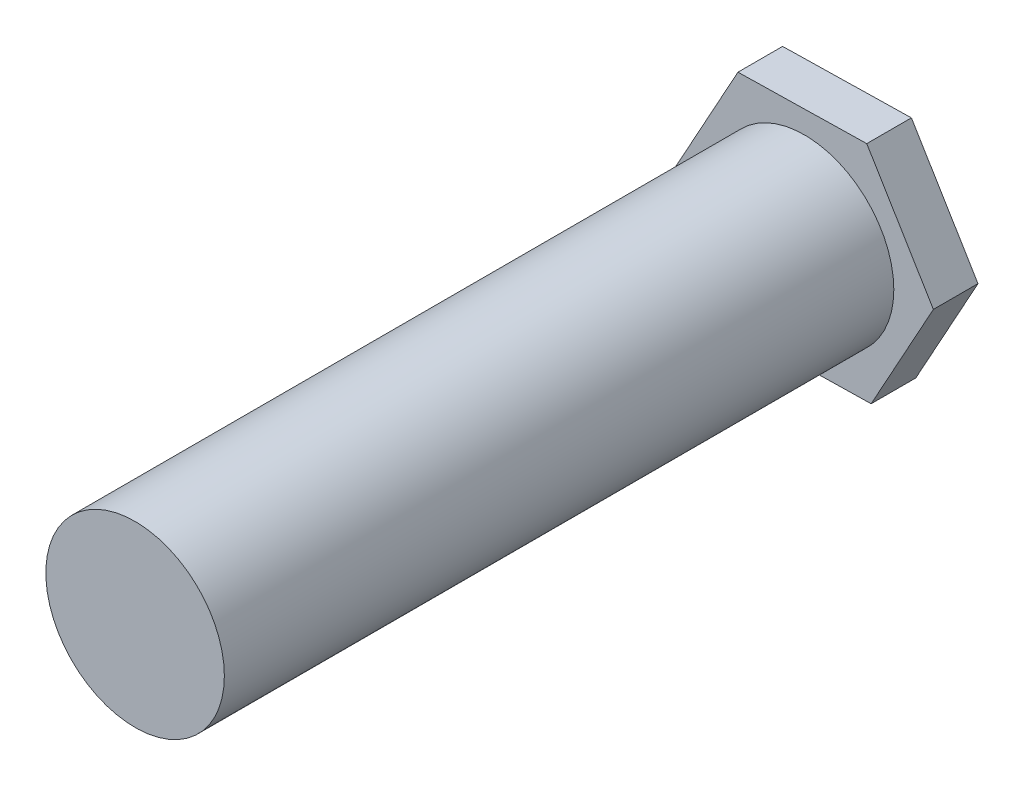
ISO-10303-21;
HEADER;
FILE_DESCRIPTION(('STEP AP214'),'2;1');
FILE_NAME('part.step','',(''),(''),'','','');
FILE_SCHEMA(('AUTOMOTIVE_DESIGN { 1 0 10303 214 1 1 1 1 }'));
ENDSEC;
DATA;
#1=APPLICATION_CONTEXT('core data for automotive mechanical design processes');
#2=APPLICATION_PROTOCOL_DEFINITION('international standard','automotive_design',2000,#1);
#3=PRODUCT_CONTEXT('',#1,'mechanical');
#4=PRODUCT('Part','Part','',(#3));
#5=PRODUCT_RELATED_PRODUCT_CATEGORY('part','',(#4));
#6=PRODUCT_DEFINITION_FORMATION('','',#4);
#7=PRODUCT_DEFINITION_CONTEXT('part definition',#1,'design');
#8=PRODUCT_DEFINITION('design','',#6,#7);
#9=PRODUCT_DEFINITION_SHAPE('','',#8);
#10=(LENGTH_UNIT() NAMED_UNIT(*) SI_UNIT(.MILLI.,.METRE.));
#11=(NAMED_UNIT(*) PLANE_ANGLE_UNIT() SI_UNIT($,.RADIAN.));
#12=(NAMED_UNIT(*) SI_UNIT($,.STERADIAN.) SOLID_ANGLE_UNIT());
#13=UNCERTAINTY_MEASURE_WITH_UNIT(LENGTH_MEASURE(1.E-05),#10,'distance_accuracy_value','');
#14=(GEOMETRIC_REPRESENTATION_CONTEXT(3) GLOBAL_UNCERTAINTY_ASSIGNED_CONTEXT((#13)) GLOBAL_UNIT_ASSIGNED_CONTEXT((#10,
#11,#12)) REPRESENTATION_CONTEXT('',''));
#15=CARTESIAN_POINT('',(0.,0.,0.));
#16=DIRECTION('',(0.,0.,1.));
#17=DIRECTION('',(1.,0.,0.));
#18=AXIS2_PLACEMENT_3D('',#15,#16,#17);
#19=CARTESIAN_POINT('',(36.6546728834895,0.719923008183474,12.7));
#20=DIRECTION('',(-0.856039963958716,-0.51690964404387,0.));
#21=DIRECTION('',(0.51690964404387,-0.856039963958716,0.));
#22=AXIS2_PLACEMENT_3D('',#19,#20,#21);
#23=PLANE('',#22);
#24=DIRECTION('',(-0.51690964404387,0.856039963958716,0.));
#25=VECTOR('',#24,1.);
#26=CARTESIAN_POINT('',(36.6546728834895,0.719923008183474,0.));
#27=LINE('',#26,#25);
#28=CARTESIAN_POINT('',(36.6546728834895,0.719923008183474,0.));
#29=VERTEX_POINT('',#28);
#30=CARTESIAN_POINT('',(17.703864827889,32.1038393886022,0.));
#31=VERTEX_POINT('',#30);
#32=EDGE_CURVE('E141',#29,#31,#27,.T.);
#33=ORIENTED_EDGE('',*,*,#32,.T.);
#34=DIRECTION('',(0.,0.,-1.));
#35=VECTOR('',#34,1.);
#36=CARTESIAN_POINT('',(17.703864827889,32.1038393886022,12.7));
#37=LINE('',#36,#35);
#38=CARTESIAN_POINT('',(17.703864827889,32.1038393886022,12.7));
#39=VERTEX_POINT('',#38);
#40=EDGE_CURVE('E58',#39,#31,#37,.T.);
#41=ORIENTED_EDGE('',*,*,#40,.F.);
#42=DIRECTION('',(-0.51690964404387,0.856039963958716,0.));
#43=VECTOR('',#42,1.);
#44=CARTESIAN_POINT('',(36.6546728834895,0.719923008183474,12.7));
#45=LINE('',#44,#43);
#46=CARTESIAN_POINT('',(36.6546728834895,0.719923008183474,12.7));
#47=VERTEX_POINT('',#46);
#48=EDGE_CURVE('E152',#47,#39,#45,.T.);
#49=ORIENTED_EDGE('',*,*,#48,.F.);
#50=DIRECTION('',(0.,0.,-1.));
#51=VECTOR('',#50,1.);
#52=CARTESIAN_POINT('',(36.6546728834895,0.719923008183474,12.7));
#53=LINE('',#52,#51);
#54=EDGE_CURVE('E137',#47,#29,#53,.T.);
#55=ORIENTED_EDGE('',*,*,#54,.T.);
#56=EDGE_LOOP('',(#33,#41,#49,#55));
#57=FACE_BOUND('',#56,.T.);
#58=ADVANCED_FACE('F55',(#57),#23,.F.);
#59=CARTESIAN_POINT('',(17.703864827889,32.1038393886022,12.7));
#60=DIRECTION('',(0.0196369012238045,-0.999807177464898,0.));
#61=DIRECTION('',(0.999807177464898,0.0196369012238045,0.));
#62=AXIS2_PLACEMENT_3D('',#59,#60,#61);
#63=PLANE('',#62);
#64=DIRECTION('',(-0.999807177464898,-0.0196369012238045,0.));
#65=VECTOR('',#64,1.);
#66=CARTESIAN_POINT('',(17.703864827889,32.1038393886022,0.));
#67=LINE('',#66,#65);
#68=CARTESIAN_POINT('',(-18.9508080556005,31.3839163804188,0.));
#69=VERTEX_POINT('',#68);
#70=EDGE_CURVE('E144',#31,#69,#67,.T.);
#71=ORIENTED_EDGE('',*,*,#70,.T.);
#72=DIRECTION('',(0.,0.,-1.));
#73=VECTOR('',#72,1.);
#74=CARTESIAN_POINT('',(-18.9508080556005,31.3839163804188,12.7));
#75=LINE('',#74,#73);
#76=CARTESIAN_POINT('',(-18.9508080556005,31.3839163804188,12.7));
#77=VERTEX_POINT('',#76);
#78=EDGE_CURVE('E155',#77,#69,#75,.T.);
#79=ORIENTED_EDGE('',*,*,#78,.F.);
#80=DIRECTION('',(-0.999807177464898,-0.0196369012238045,0.));
#81=VECTOR('',#80,1.);
#82=CARTESIAN_POINT('',(17.703864827889,32.1038393886022,12.7));
#83=LINE('',#82,#81);
#84=EDGE_CURVE('E110',#39,#77,#83,.T.);
#85=ORIENTED_EDGE('',*,*,#84,.F.);
#86=ORIENTED_EDGE('',*,*,#40,.T.);
#87=EDGE_LOOP('',(#71,#79,#85,#86));
#88=FACE_BOUND('',#87,.T.);
#89=ADVANCED_FACE('F160',(#88),#63,.F.);
#90=CARTESIAN_POINT('',(-18.9508080556005,31.3839163804188,12.7));
#91=DIRECTION('',(0.875676865182521,-0.482897533421028,0.));
#92=DIRECTION('',(0.482897533421028,0.875676865182521,0.));
#93=AXIS2_PLACEMENT_3D('',#90,#91,#92);
#94=PLANE('',#93);
#95=DIRECTION('',(-0.482897533421028,-0.875676865182521,0.));
#96=VECTOR('',#95,1.);
#97=CARTESIAN_POINT('',(-18.9508080556005,31.3839163804188,0.));
#98=LINE('',#97,#96);
#99=CARTESIAN_POINT('',(-36.6546728834895,-0.719923008183475,0.));
#100=VERTEX_POINT('',#99);
#101=EDGE_CURVE('E147',#69,#100,#98,.T.);
#102=ORIENTED_EDGE('',*,*,#101,.T.);
#103=DIRECTION('',(0.,0.,-1.));
#104=VECTOR('',#103,1.);
#105=CARTESIAN_POINT('',(-36.6546728834895,-0.719923008183475,12.7));
#106=LINE('',#105,#104);
#107=CARTESIAN_POINT('',(-36.6546728834895,-0.719923008183475,12.7));
#108=VERTEX_POINT('',#107);
#109=EDGE_CURVE('E132',#108,#100,#106,.T.);
#110=ORIENTED_EDGE('',*,*,#109,.F.);
#111=DIRECTION('',(-0.482897533421028,-0.875676865182521,0.));
#112=VECTOR('',#111,1.);
#113=CARTESIAN_POINT('',(-18.9508080556005,31.3839163804188,12.7));
#114=LINE('',#113,#112);
#115=EDGE_CURVE('E123',#77,#108,#114,.T.);
#116=ORIENTED_EDGE('',*,*,#115,.F.);
#117=ORIENTED_EDGE('',*,*,#78,.T.);
#118=EDGE_LOOP('',(#102,#110,#116,#117));
#119=FACE_BOUND('',#118,.T.);
#120=ADVANCED_FACE('F166',(#119),#94,.F.);
#121=CARTESIAN_POINT('',(-36.6546728834895,-0.719923008183475,12.7));
#122=DIRECTION('',(0.856039963958716,0.51690964404387,0.));
#123=DIRECTION('',(-0.51690964404387,0.856039963958716,0.));
#124=AXIS2_PLACEMENT_3D('',#121,#122,#123);
#125=PLANE('',#124);
#126=DIRECTION('',(0.51690964404387,-0.856039963958716,0.));
#127=VECTOR('',#126,1.);
#128=CARTESIAN_POINT('',(-36.6546728834895,-0.719923008183475,0.));
#129=LINE('',#128,#127);
#130=CARTESIAN_POINT('',(-17.7038648278889,-32.1038393886022,0.));
#131=VERTEX_POINT('',#130);
#132=EDGE_CURVE('E131',#100,#131,#129,.T.);
#133=ORIENTED_EDGE('',*,*,#132,.T.);
#134=DIRECTION('',(0.,0.,-1.));
#135=VECTOR('',#134,1.);
#136=CARTESIAN_POINT('',(-17.7038648278889,-32.1038393886022,12.7));
#137=LINE('',#136,#135);
#138=CARTESIAN_POINT('',(-17.7038648278889,-32.1038393886022,12.7));
#139=VERTEX_POINT('',#138);
#140=EDGE_CURVE('E128',#139,#131,#137,.T.);
#141=ORIENTED_EDGE('',*,*,#140,.F.);
#142=DIRECTION('',(0.51690964404387,-0.856039963958716,0.));
#143=VECTOR('',#142,1.);
#144=CARTESIAN_POINT('',(-36.6546728834895,-0.719923008183475,12.7));
#145=LINE('',#144,#143);
#146=EDGE_CURVE('E117',#108,#139,#145,.T.);
#147=ORIENTED_EDGE('',*,*,#146,.F.);
#148=ORIENTED_EDGE('',*,*,#109,.T.);
#149=EDGE_LOOP('',(#133,#141,#147,#148));
#150=FACE_BOUND('',#149,.T.);
#151=ADVANCED_FACE('F129',(#150),#125,.F.);
#152=CARTESIAN_POINT('',(-17.7038648278889,-32.1038393886022,12.7));
#153=DIRECTION('',(-0.0196369012238047,0.999807177464898,0.));
#154=DIRECTION('',(-0.999807177464898,-0.0196369012238047,0.));
#155=AXIS2_PLACEMENT_3D('',#152,#153,#154);
#156=PLANE('',#155);
#157=DIRECTION('',(0.999807177464898,0.0196369012238047,0.));
#158=VECTOR('',#157,1.);
#159=CARTESIAN_POINT('',(-17.7038648278889,-32.1038393886022,0.));
#160=LINE('',#159,#158);
#161=CARTESIAN_POINT('',(18.9508080556006,-31.3839163804188,0.));
#162=VERTEX_POINT('',#161);
#163=EDGE_CURVE('E95',#131,#162,#160,.T.);
#164=ORIENTED_EDGE('',*,*,#163,.T.);
#165=DIRECTION('',(0.,0.,-1.));
#166=VECTOR('',#165,1.);
#167=CARTESIAN_POINT('',(18.9508080556006,-31.3839163804188,12.7));
#168=LINE('',#167,#166);
#169=CARTESIAN_POINT('',(18.9508080556006,-31.3839163804188,12.7));
#170=VERTEX_POINT('',#169);
#171=EDGE_CURVE('E133',#170,#162,#168,.T.);
#172=ORIENTED_EDGE('',*,*,#171,.F.);
#173=DIRECTION('',(0.999807177464898,0.0196369012238047,0.));
#174=VECTOR('',#173,1.);
#175=CARTESIAN_POINT('',(-17.7038648278889,-32.1038393886022,12.7));
#176=LINE('',#175,#174);
#177=EDGE_CURVE('E121',#139,#170,#176,.T.);
#178=ORIENTED_EDGE('',*,*,#177,.F.);
#179=ORIENTED_EDGE('',*,*,#140,.T.);
#180=EDGE_LOOP('',(#164,#172,#178,#179));
#181=FACE_BOUND('',#180,.T.);
#182=ADVANCED_FACE('F135',(#181),#156,.F.);
#183=CARTESIAN_POINT('',(18.9508080556006,-31.3839163804188,12.7));
#184=DIRECTION('',(-0.875676865182521,0.482897533421028,0.));
#185=DIRECTION('',(-0.482897533421029,-0.875676865182521,0.));
#186=AXIS2_PLACEMENT_3D('',#183,#184,#185);
#187=PLANE('',#186);
#188=DIRECTION('',(0.482897533421028,0.875676865182521,0.));
#189=VECTOR('',#188,1.);
#190=CARTESIAN_POINT('',(18.9508080556006,-31.3839163804188,0.));
#191=LINE('',#190,#189);
#192=EDGE_CURVE('E101',#162,#29,#191,.T.);
#193=ORIENTED_EDGE('',*,*,#192,.T.);
#194=ORIENTED_EDGE('',*,*,#54,.F.);
#195=DIRECTION('',(0.482897533421028,0.875676865182521,0.));
#196=VECTOR('',#195,1.);
#197=CARTESIAN_POINT('',(18.9508080556006,-31.3839163804188,12.7));
#198=LINE('',#197,#196);
#199=EDGE_CURVE('E72',#170,#47,#198,.T.);
#200=ORIENTED_EDGE('',*,*,#199,.F.);
#201=ORIENTED_EDGE('',*,*,#171,.T.);
#202=EDGE_LOOP('',(#193,#194,#200,#201));
#203=FACE_BOUND('',#202,.T.);
#204=ADVANCED_FACE('F191',(#203),#187,.F.);
#205=CARTESIAN_POINT('',(0.,0.,12.7));
#206=DIRECTION('',(0.,0.,1.));
#207=DIRECTION('',(1.,0.,0.));
#208=AXIS2_PLACEMENT_3D('',#205,#206,#207);
#209=PLANE('',#208);
#210=CARTESIAN_POINT('',(0.,0.,12.7));
#211=DIRECTION('',(0.,0.,1.));
#212=DIRECTION('',(1.,0.,0.));
#213=AXIS2_PLACEMENT_3D('',#210,#211,#212);
#214=CIRCLE('',#213,25.4);
#215=CARTESIAN_POINT('',(25.4,0.,12.7));
#216=VERTEX_POINT('',#215);
#217=EDGE_CURVE('E13',#216,#216,#214,.T.);
#218=ORIENTED_EDGE('',*,*,#217,.F.);
#219=EDGE_LOOP('',(#218));
#220=FACE_BOUND('',#219,.T.);
#221=ORIENTED_EDGE('',*,*,#48,.T.);
#222=ORIENTED_EDGE('',*,*,#84,.T.);
#223=ORIENTED_EDGE('',*,*,#115,.T.);
#224=ORIENTED_EDGE('',*,*,#146,.T.);
#225=ORIENTED_EDGE('',*,*,#177,.T.);
#226=ORIENTED_EDGE('',*,*,#199,.T.);
#227=EDGE_LOOP('',(#221,#222,#223,#224,#225,#226));
#228=FACE_BOUND('',#227,.T.);
#229=ADVANCED_FACE('F119',(#220,#228),#209,.T.);
#230=CARTESIAN_POINT('',(0.,0.,0.));
#231=DIRECTION('',(0.,0.,1.));
#232=DIRECTION('',(1.,0.,0.));
#233=AXIS2_PLACEMENT_3D('',#230,#231,#232);
#234=PLANE('',#233);
#235=ORIENTED_EDGE('',*,*,#32,.F.);
#236=ORIENTED_EDGE('',*,*,#192,.F.);
#237=ORIENTED_EDGE('',*,*,#163,.F.);
#238=ORIENTED_EDGE('',*,*,#132,.F.);
#239=ORIENTED_EDGE('',*,*,#101,.F.);
#240=ORIENTED_EDGE('',*,*,#70,.F.);
#241=EDGE_LOOP('',(#235,#236,#237,#238,#239,#240));
#242=FACE_BOUND('',#241,.T.);
#243=ADVANCED_FACE('F165',(#242),#234,.F.);
#244=CARTESIAN_POINT('',(0.,0.,203.2));
#245=DIRECTION('',(0.,0.,-1.));
#246=DIRECTION('',(-1.,0.,0.));
#247=AXIS2_PLACEMENT_3D('',#244,#245,#246);
#248=CYLINDRICAL_SURFACE('',#247,25.4);
#249=CARTESIAN_POINT('',(0.,0.,203.2));
#250=DIRECTION('',(0.,0.,1.));
#251=DIRECTION('',(1.,0.,0.));
#252=AXIS2_PLACEMENT_3D('',#249,#250,#251);
#253=CIRCLE('',#252,25.4);
#254=CARTESIAN_POINT('',(25.4,0.,203.2));
#255=VERTEX_POINT('',#254);
#256=EDGE_CURVE('E145',#255,#255,#253,.T.);
#257=ORIENTED_EDGE('',*,*,#256,.F.);
#258=EDGE_LOOP('',(#257));
#259=FACE_BOUND('',#258,.T.);
#260=ORIENTED_EDGE('',*,*,#217,.T.);
#261=EDGE_LOOP('',(#260));
#262=FACE_BOUND('',#261,.T.);
#263=ADVANCED_FACE('F184',(#259,#262),#248,.T.);
#264=CARTESIAN_POINT('',(0.,0.,203.2));
#265=DIRECTION('',(0.,0.,1.));
#266=DIRECTION('',(1.,0.,0.));
#267=AXIS2_PLACEMENT_3D('',#264,#265,#266);
#268=PLANE('',#267);
#269=ORIENTED_EDGE('',*,*,#256,.T.);
#270=EDGE_LOOP('',(#269));
#271=FACE_BOUND('',#270,.T.);
#272=ADVANCED_FACE('F182',(#271),#268,.T.);
#273=CLOSED_SHELL('',(#58,#89,#120,#151,#182,#204,#229,#243,#263,#272));
#274=MANIFOLD_SOLID_BREP('B2',#273);
#275=ADVANCED_BREP_SHAPE_REPRESENTATION('',(#18,#274),#14);
#276=SHAPE_DEFINITION_REPRESENTATION(#9,#275);
ENDSEC;
END-ISO-10303-21;
